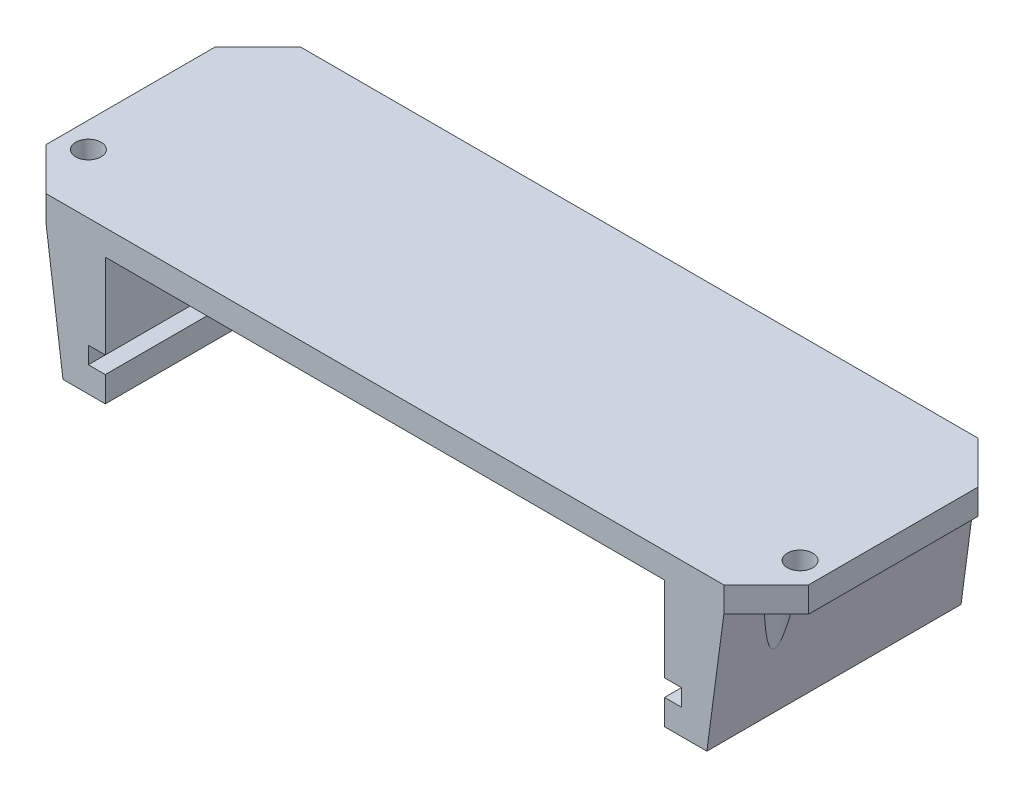
ISO-10303-21;
HEADER;
FILE_DESCRIPTION(('STEP AP214'),'2;1');
FILE_NAME('part.step','',(''),(''),'','','');
FILE_SCHEMA(('AUTOMOTIVE_DESIGN { 1 0 10303 214 1 1 1 1 }'));
ENDSEC;
DATA;
#1=APPLICATION_CONTEXT('core data for automotive mechanical design processes');
#2=APPLICATION_PROTOCOL_DEFINITION('international standard','automotive_design',2000,#1);
#3=PRODUCT_CONTEXT('',#1,'mechanical');
#4=PRODUCT('Part','Part','',(#3));
#5=PRODUCT_RELATED_PRODUCT_CATEGORY('part','',(#4));
#6=PRODUCT_DEFINITION_FORMATION('','',#4);
#7=PRODUCT_DEFINITION_CONTEXT('part definition',#1,'design');
#8=PRODUCT_DEFINITION('design','',#6,#7);
#9=PRODUCT_DEFINITION_SHAPE('','',#8);
#10=(LENGTH_UNIT() NAMED_UNIT(*) SI_UNIT(.MILLI.,.METRE.));
#11=(NAMED_UNIT(*) PLANE_ANGLE_UNIT() SI_UNIT($,.RADIAN.));
#12=(NAMED_UNIT(*) SI_UNIT($,.STERADIAN.) SOLID_ANGLE_UNIT());
#13=UNCERTAINTY_MEASURE_WITH_UNIT(LENGTH_MEASURE(1.E-05),#10,'distance_accuracy_value','');
#14=(GEOMETRIC_REPRESENTATION_CONTEXT(3) GLOBAL_UNCERTAINTY_ASSIGNED_CONTEXT((#13)) GLOBAL_UNIT_ASSIGNED_CONTEXT((#10,
#11,#12)) REPRESENTATION_CONTEXT('',''));
#15=CARTESIAN_POINT('',(0.,0.,0.));
#16=DIRECTION('',(0.,0.,1.));
#17=DIRECTION('',(1.,0.,0.));
#18=AXIS2_PLACEMENT_3D('',#15,#16,#17);
#19=CARTESIAN_POINT('',(-4.50560941751226,-0.600747922334966,-30.));
#20=DIRECTION('',(0.991227900682635,0.132163720091018,0.));
#21=DIRECTION('',(-0.132163720091018,0.991227900682635,0.));
#22=AXIS2_PLACEMENT_3D('',#19,#20,#21);
#23=PLANE('',#22);
#24=CARTESIAN_POINT('',(-7.,18.1071814463232,-7.));
#25=DIRECTION('',(0.991227900682635,0.132163720091018,0.));
#26=DIRECTION('',(-0.132163720091018,0.991227900682635,0.));
#27=AXIS2_PLACEMENT_3D('',#24,#25,#26);
#28=ELLIPSE('',#27,22.6991189256324,3.);
#29=CARTESIAN_POINT('',(-5.,3.10718144632311,-9.23606797749979));
#30=VERTEX_POINT('',#29);
#31=CARTESIAN_POINT('',(-5.,3.10718144632312,-4.76393202250021));
#32=VERTEX_POINT('',#31);
#33=EDGE_CURVE('E196',#30,#32,#28,.F.);
#34=ORIENTED_EDGE('',*,*,#33,.F.);
#35=DIRECTION('',(0.,0.,1.));
#36=VECTOR('',#35,1.);
#37=CARTESIAN_POINT('',(-5.,3.10718144632312,-30.));
#38=LINE('',#37,#36);
#39=CARTESIAN_POINT('',(-5.,3.10718144632312,-30.));
#40=VERTEX_POINT('',#39);
#41=EDGE_CURVE('E210',#40,#30,#38,.T.);
#42=ORIENTED_EDGE('',*,*,#41,.F.);
#43=DIRECTION('',(-0.132163720091018,0.991227900682635,0.));
#44=VECTOR('',#43,1.);
#45=CARTESIAN_POINT('',(-4.50560941751226,-0.600747922334966,-30.));
#46=LINE('',#45,#44);
#47=CARTESIAN_POINT('',(-3.,-11.8928185536769,-30.));
#48=VERTEX_POINT('',#47);
#49=EDGE_CURVE('E312',#48,#40,#46,.T.);
#50=ORIENTED_EDGE('',*,*,#49,.F.);
#51=DIRECTION('',(0.,0.,1.));
#52=VECTOR('',#51,1.);
#53=CARTESIAN_POINT('',(-3.,-11.8928185536769,-30.));
#54=LINE('',#53,#52);
#55=CARTESIAN_POINT('',(-3.,-11.8928185536769,0.));
#56=VERTEX_POINT('',#55);
#57=EDGE_CURVE('E267',#48,#56,#54,.T.);
#58=ORIENTED_EDGE('',*,*,#57,.T.);
#59=DIRECTION('',(-0.132163720091018,0.991227900682635,0.));
#60=VECTOR('',#59,1.);
#61=CARTESIAN_POINT('',(-4.50560941751226,-0.600747922334966,0.));
#62=LINE('',#61,#60);
#63=CARTESIAN_POINT('',(-5.,3.10718144632312,0.));
#64=VERTEX_POINT('',#63);
#65=EDGE_CURVE('E214',#56,#64,#62,.T.);
#66=ORIENTED_EDGE('',*,*,#65,.T.);
#67=EDGE_CURVE('E208',#32,#64,#38,.T.);
#68=ORIENTED_EDGE('',*,*,#67,.F.);
#69=EDGE_LOOP('',(#34,#42,#50,#58,#66,#68));
#70=FACE_BOUND('',#69,.T.);
#71=ADVANCED_FACE('F36',(#70),#23,.F.);
#72=CARTESIAN_POINT('',(0.,3.10718144632312,-30.));
#73=DIRECTION('',(0.,-1.,0.));
#74=DIRECTION('',(0.,0.,-1.));
#75=AXIS2_PLACEMENT_3D('',#72,#73,#74);
#76=PLANE('',#75);
#77=ORIENTED_EDGE('',*,*,#67,.T.);
#78=DIRECTION('',(-0.707106781186549,0.,-0.707106781186547));
#79=VECTOR('',#78,1.);
#80=CARTESIAN_POINT('',(-17.5,3.10718144632312,-12.5));
#81=LINE('',#80,#79);
#82=CARTESIAN_POINT('',(-10.,3.10718144632312,-4.99999999999999));
#83=VERTEX_POINT('',#82);
#84=EDGE_CURVE('E11',#64,#83,#81,.T.);
#85=ORIENTED_EDGE('',*,*,#84,.T.);
#86=DIRECTION('',(0.,0.,1.));
#87=VECTOR('',#86,1.);
#88=CARTESIAN_POINT('',(-10.,3.10718144632312,-30.));
#89=LINE('',#88,#87);
#90=CARTESIAN_POINT('',(-10.,3.10718144632312,-25.));
#91=VERTEX_POINT('',#90);
#92=EDGE_CURVE('E215',#91,#83,#89,.T.);
#93=ORIENTED_EDGE('',*,*,#92,.F.);
#94=DIRECTION('',(-0.707106781186547,0.,0.707106781186549));
#95=VECTOR('',#94,1.);
#96=CARTESIAN_POINT('',(-2.5,3.10718144632312,-32.5));
#97=LINE('',#96,#95);
#98=EDGE_CURVE('E44',#91,#40,#97,.F.);
#99=ORIENTED_EDGE('',*,*,#98,.T.);
#100=ORIENTED_EDGE('',*,*,#41,.T.);
#101=CARTESIAN_POINT('',(-7.,3.10718144632312,-7.));
#102=DIRECTION('',(0.,-1.,0.));
#103=DIRECTION('',(0.,0.,-1.));
#104=AXIS2_PLACEMENT_3D('',#101,#102,#103);
#105=CIRCLE('',#104,3.);
#106=EDGE_CURVE('E199',#30,#32,#105,.T.);
#107=ORIENTED_EDGE('',*,*,#106,.T.);
#108=EDGE_LOOP('',(#77,#85,#93,#99,#100,#107));
#109=FACE_BOUND('',#108,.T.);
#110=CARTESIAN_POINT('',(-7.,3.10718144632312,-7.));
#111=DIRECTION('',(0.,-1.,0.));
#112=DIRECTION('',(0.,0.,-1.));
#113=AXIS2_PLACEMENT_3D('',#110,#111,#112);
#114=CIRCLE('',#113,1.5);
#115=CARTESIAN_POINT('',(-7.,3.10718144632312,-8.5));
#116=VERTEX_POINT('',#115);
#117=EDGE_CURVE('E273',#116,#116,#114,.T.);
#118=ORIENTED_EDGE('',*,*,#117,.F.);
#119=EDGE_LOOP('',(#118));
#120=FACE_BOUND('',#119,.T.);
#121=ADVANCED_FACE('F206',(#109,#120),#76,.T.);
#122=CARTESIAN_POINT('',(-10.,0.,-30.));
#123=DIRECTION('',(1.,0.,0.));
#124=DIRECTION('',(0.,1.,0.));
#125=AXIS2_PLACEMENT_3D('',#122,#123,#124);
#126=PLANE('',#125);
#127=ORIENTED_EDGE('',*,*,#92,.T.);
#128=DIRECTION('',(0.,1.,0.));
#129=VECTOR('',#128,1.);
#130=CARTESIAN_POINT('',(-10.,6.10718144632312,-4.99999999999999));
#131=LINE('',#130,#129);
#132=CARTESIAN_POINT('',(-10.,6.10718144632312,-4.99999999999999));
#133=VERTEX_POINT('',#132);
#134=EDGE_CURVE('E304',#83,#133,#131,.T.);
#135=ORIENTED_EDGE('',*,*,#134,.T.);
#136=DIRECTION('',(0.,0.,1.));
#137=VECTOR('',#136,1.);
#138=CARTESIAN_POINT('',(-10.,6.10718144632312,-30.));
#139=LINE('',#138,#137);
#140=CARTESIAN_POINT('',(-10.,6.10718144632312,-25.));
#141=VERTEX_POINT('',#140);
#142=EDGE_CURVE('E218',#141,#133,#139,.T.);
#143=ORIENTED_EDGE('',*,*,#142,.F.);
#144=DIRECTION('',(0.,-1.,0.));
#145=VECTOR('',#144,1.);
#146=CARTESIAN_POINT('',(-10.,0.,-25.));
#147=LINE('',#146,#145);
#148=EDGE_CURVE('E56',#141,#91,#147,.T.);
#149=ORIENTED_EDGE('',*,*,#148,.T.);
#150=EDGE_LOOP('',(#127,#135,#143,#149));
#151=FACE_BOUND('',#150,.T.);
#152=ADVANCED_FACE('F323',(#151),#126,.F.);
#153=CARTESIAN_POINT('',(0.,6.10718144632312,-30.));
#154=DIRECTION('',(0.,-1.,0.));
#155=DIRECTION('',(0.,0.,-1.));
#156=AXIS2_PLACEMENT_3D('',#153,#154,#155);
#157=PLANE('',#156);
#158=CARTESIAN_POINT('',(77.,6.10718144632312,-7.));
#159=DIRECTION('',(0.,-1.,0.));
#160=DIRECTION('',(0.,0.,-1.));
#161=AXIS2_PLACEMENT_3D('',#158,#159,#160);
#162=CIRCLE('',#161,1.5);
#163=CARTESIAN_POINT('',(77.,6.10718144632312,-8.5));
#164=VERTEX_POINT('',#163);
#165=EDGE_CURVE('E408',#164,#164,#162,.T.);
#166=ORIENTED_EDGE('',*,*,#165,.T.);
#167=EDGE_LOOP('',(#166));
#168=FACE_BOUND('',#167,.T.);
#169=CARTESIAN_POINT('',(-7.,6.10718144632312,-7.));
#170=DIRECTION('',(0.,-1.,0.));
#171=DIRECTION('',(0.,0.,-1.));
#172=AXIS2_PLACEMENT_3D('',#169,#170,#171);
#173=CIRCLE('',#172,1.5);
#174=CARTESIAN_POINT('',(-7.,6.10718144632312,-8.5));
#175=VERTEX_POINT('',#174);
#176=EDGE_CURVE('E270',#175,#175,#173,.T.);
#177=ORIENTED_EDGE('',*,*,#176,.T.);
#178=EDGE_LOOP('',(#177));
#179=FACE_BOUND('',#178,.T.);
#180=DIRECTION('',(1.,0.,0.));
#181=VECTOR('',#180,1.);
#182=CARTESIAN_POINT('',(0.,6.10718144632312,0.));
#183=LINE('',#182,#181);
#184=CARTESIAN_POINT('',(-4.99999999999999,6.10718144632312,0.));
#185=VERTEX_POINT('',#184);
#186=CARTESIAN_POINT('',(75.,6.10718144632312,0.));
#187=VERTEX_POINT('',#186);
#188=EDGE_CURVE('E221',#185,#187,#183,.T.);
#189=ORIENTED_EDGE('',*,*,#188,.T.);
#190=DIRECTION('',(-0.707106781186547,0.,0.707106781186549));
#191=VECTOR('',#190,1.);
#192=CARTESIAN_POINT('',(75.,6.10718144632312,0.));
#193=LINE('',#192,#191);
#194=CARTESIAN_POINT('',(80.,6.10718144632312,-5.));
#195=VERTEX_POINT('',#194);
#196=EDGE_CURVE('E287',#187,#195,#193,.F.);
#197=ORIENTED_EDGE('',*,*,#196,.T.);
#198=DIRECTION('',(0.,0.,1.));
#199=VECTOR('',#198,1.);
#200=CARTESIAN_POINT('',(80.,6.10718144632312,-30.));
#201=LINE('',#200,#199);
#202=CARTESIAN_POINT('',(80.,6.10718144632312,-25.));
#203=VERTEX_POINT('',#202);
#204=EDGE_CURVE('E226',#203,#195,#201,.T.);
#205=ORIENTED_EDGE('',*,*,#204,.F.);
#206=DIRECTION('',(-0.707106781186549,0.,-0.707106781186547));
#207=VECTOR('',#206,1.);
#208=CARTESIAN_POINT('',(80.,6.10718144632312,-25.));
#209=LINE('',#208,#207);
#210=CARTESIAN_POINT('',(75.,6.10718144632312,-30.));
#211=VERTEX_POINT('',#210);
#212=EDGE_CURVE('E285',#203,#211,#209,.T.);
#213=ORIENTED_EDGE('',*,*,#212,.T.);
#214=DIRECTION('',(1.,0.,0.));
#215=VECTOR('',#214,1.);
#216=CARTESIAN_POINT('',(0.,6.10718144632312,-30.));
#217=LINE('',#216,#215);
#218=CARTESIAN_POINT('',(-4.99999999999998,6.10718144632312,-30.));
#219=VERTEX_POINT('',#218);
#220=EDGE_CURVE('E269',#219,#211,#217,.T.);
#221=ORIENTED_EDGE('',*,*,#220,.F.);
#222=DIRECTION('',(0.707106781186547,0.,-0.707106781186549));
#223=VECTOR('',#222,1.);
#224=CARTESIAN_POINT('',(-4.99999999999998,6.10718144632312,-30.));
#225=LINE('',#224,#223);
#226=EDGE_CURVE('E281',#219,#141,#225,.F.);
#227=ORIENTED_EDGE('',*,*,#226,.T.);
#228=ORIENTED_EDGE('',*,*,#142,.T.);
#229=DIRECTION('',(0.707106781186549,0.,0.707106781186547));
#230=VECTOR('',#229,1.);
#231=CARTESIAN_POINT('',(-10.,6.10718144632312,-4.99999999999999));
#232=LINE('',#231,#230);
#233=EDGE_CURVE('E283',#133,#185,#232,.T.);
#234=ORIENTED_EDGE('',*,*,#233,.T.);
#235=EDGE_LOOP('',(#189,#197,#205,#213,#221,#227,#228,#234));
#236=FACE_BOUND('',#235,.T.);
#237=ADVANCED_FACE('F322',(#168,#179,#236),#157,.F.);
#238=CARTESIAN_POINT('',(80.,0.,-30.));
#239=DIRECTION('',(1.,0.,0.));
#240=DIRECTION('',(0.,0.,-1.));
#241=AXIS2_PLACEMENT_3D('',#238,#239,#240);
#242=PLANE('',#241);
#243=ORIENTED_EDGE('',*,*,#204,.T.);
#244=DIRECTION('',(0.,-1.,0.));
#245=VECTOR('',#244,1.);
#246=CARTESIAN_POINT('',(80.,0.,-5.));
#247=LINE('',#246,#245);
#248=CARTESIAN_POINT('',(80.,3.10718144632312,-5.));
#249=VERTEX_POINT('',#248);
#250=EDGE_CURVE('E292',#195,#249,#247,.T.);
#251=ORIENTED_EDGE('',*,*,#250,.T.);
#252=DIRECTION('',(0.,0.,1.));
#253=VECTOR('',#252,1.);
#254=CARTESIAN_POINT('',(80.,3.10718144632312,-30.));
#255=LINE('',#254,#253);
#256=CARTESIAN_POINT('',(80.,3.10718144632312,-25.));
#257=VERTEX_POINT('',#256);
#258=EDGE_CURVE('E229',#257,#249,#255,.T.);
#259=ORIENTED_EDGE('',*,*,#258,.F.);
#260=DIRECTION('',(0.,1.,0.));
#261=VECTOR('',#260,1.);
#262=CARTESIAN_POINT('',(80.,6.10718144632312,-25.));
#263=LINE('',#262,#261);
#264=EDGE_CURVE('E289',#257,#203,#263,.T.);
#265=ORIENTED_EDGE('',*,*,#264,.T.);
#266=EDGE_LOOP('',(#243,#251,#259,#265));
#267=FACE_BOUND('',#266,.T.);
#268=ADVANCED_FACE('F434',(#267),#242,.T.);
#269=ORIENTED_EDGE('',*,*,#258,.T.);
#270=DIRECTION('',(0.707106781186547,0.,-0.707106781186549));
#271=VECTOR('',#270,1.);
#272=CARTESIAN_POINT('',(52.5000000000001,3.10718144632312,22.5));
#273=LINE('',#272,#271);
#274=CARTESIAN_POINT('',(74.9999999999999,3.10718144632312,0.));
#275=VERTEX_POINT('',#274);
#276=EDGE_CURVE('E296',#249,#275,#273,.F.);
#277=ORIENTED_EDGE('',*,*,#276,.T.);
#278=DIRECTION('',(0.,0.,1.));
#279=VECTOR('',#278,1.);
#280=CARTESIAN_POINT('',(74.9999999999999,3.10718144632312,-30.));
#281=LINE('',#280,#279);
#282=CARTESIAN_POINT('',(74.9999999999999,3.10718144632312,-4.76393202250026));
#283=VERTEX_POINT('',#282);
#284=EDGE_CURVE('E235',#283,#275,#281,.T.);
#285=ORIENTED_EDGE('',*,*,#284,.F.);
#286=CARTESIAN_POINT('',(77.,3.10718144632312,-7.));
#287=DIRECTION('',(0.,-1.,0.));
#288=DIRECTION('',(0.,0.,-1.));
#289=AXIS2_PLACEMENT_3D('',#286,#287,#288);
#290=CIRCLE('',#289,3.00000000000001);
#291=CARTESIAN_POINT('',(74.9999999999999,3.10718144632312,-9.23606797749973));
#292=VERTEX_POINT('',#291);
#293=EDGE_CURVE('E204',#283,#292,#290,.T.);
#294=ORIENTED_EDGE('',*,*,#293,.T.);
#295=CARTESIAN_POINT('',(74.9999999999999,3.10718144632312,-30.));
#296=VERTEX_POINT('',#295);
#297=EDGE_CURVE('E232',#296,#292,#281,.T.);
#298=ORIENTED_EDGE('',*,*,#297,.F.);
#299=DIRECTION('',(0.707106781186549,0.,0.707106781186547));
#300=VECTOR('',#299,1.);
#301=CARTESIAN_POINT('',(37.4999999999999,3.10718144632312,-67.5));
#302=LINE('',#301,#300);
#303=EDGE_CURVE('E294',#296,#257,#302,.T.);
#304=ORIENTED_EDGE('',*,*,#303,.T.);
#305=EDGE_LOOP('',(#269,#277,#285,#294,#298,#304));
#306=FACE_BOUND('',#305,.T.);
#307=CARTESIAN_POINT('',(77.,3.10718144632312,-7.));
#308=DIRECTION('',(0.,-1.,0.));
#309=DIRECTION('',(0.,0.,-1.));
#310=AXIS2_PLACEMENT_3D('',#307,#308,#309);
#311=CIRCLE('',#310,1.5);
#312=CARTESIAN_POINT('',(77.,3.10718144632312,-8.5));
#313=VERTEX_POINT('',#312);
#314=EDGE_CURVE('E411',#313,#313,#311,.T.);
#315=ORIENTED_EDGE('',*,*,#314,.F.);
#316=EDGE_LOOP('',(#315));
#317=FACE_BOUND('',#316,.T.);
#318=ADVANCED_FACE('F418',(#306,#317),#76,.T.);
#319=CARTESIAN_POINT('',(73.2829019939315,-9.77105359919046,-30.));
#320=DIRECTION('',(0.991227900682635,-0.132163720091013,0.));
#321=DIRECTION('',(0.132163720091013,0.991227900682636,0.));
#322=AXIS2_PLACEMENT_3D('',#319,#320,#321);
#323=PLANE('',#322);
#324=ORIENTED_EDGE('',*,*,#297,.T.);
#325=CARTESIAN_POINT('',(77.,18.1071814463243,-7.));
#326=DIRECTION('',(0.991227900682635,-0.132163720091013,0.));
#327=DIRECTION('',(0.132163720091013,0.991227900682635,0.));
#328=AXIS2_PLACEMENT_3D('',#325,#326,#327);
#329=ELLIPSE('',#328,22.6991189256333,3.00000000000001);
#330=EDGE_CURVE('E217',#292,#283,#329,.F.);
#331=ORIENTED_EDGE('',*,*,#330,.T.);
#332=ORIENTED_EDGE('',*,*,#284,.T.);
#333=DIRECTION('',(0.132163720091013,0.991227900682636,0.));
#334=VECTOR('',#333,1.);
#335=CARTESIAN_POINT('',(73.2829019939315,-9.77105359919046,0.));
#336=LINE('',#335,#334);
#337=CARTESIAN_POINT('',(73.,-11.8928185536769,0.));
#338=VERTEX_POINT('',#337);
#339=EDGE_CURVE('E333',#338,#275,#336,.T.);
#340=ORIENTED_EDGE('',*,*,#339,.F.);
#341=DIRECTION('',(0.,0.,1.));
#342=VECTOR('',#341,1.);
#343=CARTESIAN_POINT('',(73.,-11.8928185536769,-30.));
#344=LINE('',#343,#342);
#345=CARTESIAN_POINT('',(73.,-11.8928185536769,-30.));
#346=VERTEX_POINT('',#345);
#347=EDGE_CURVE('E236',#346,#338,#344,.T.);
#348=ORIENTED_EDGE('',*,*,#347,.F.);
#349=DIRECTION('',(0.132163720091013,0.991227900682636,0.));
#350=VECTOR('',#349,1.);
#351=CARTESIAN_POINT('',(73.2829019939315,-9.77105359919046,-30.));
#352=LINE('',#351,#350);
#353=EDGE_CURVE('E371',#346,#296,#352,.T.);
#354=ORIENTED_EDGE('',*,*,#353,.T.);
#355=EDGE_LOOP('',(#324,#331,#332,#340,#348,#354));
#356=FACE_BOUND('',#355,.T.);
#357=ADVANCED_FACE('F423',(#356),#323,.T.);
#358=CARTESIAN_POINT('',(0.,-11.8928185536769,-30.));
#359=DIRECTION('',(0.,-1.,0.));
#360=DIRECTION('',(0.,0.,-1.));
#361=AXIS2_PLACEMENT_3D('',#358,#359,#360);
#362=PLANE('',#361);
#363=DIRECTION('',(1.,0.,0.));
#364=VECTOR('',#363,1.);
#365=CARTESIAN_POINT('',(0.,-11.8928185536769,0.));
#366=LINE('',#365,#364);
#367=CARTESIAN_POINT('',(68.,-11.8928185536769,0.));
#368=VERTEX_POINT('',#367);
#369=EDGE_CURVE('E334',#368,#338,#366,.T.);
#370=ORIENTED_EDGE('',*,*,#369,.F.);
#371=DIRECTION('',(0.,0.,1.));
#372=VECTOR('',#371,1.);
#373=CARTESIAN_POINT('',(68.,-11.8928185536769,-30.));
#374=LINE('',#373,#372);
#375=CARTESIAN_POINT('',(68.,-11.8928185536769,-30.));
#376=VERTEX_POINT('',#375);
#377=EDGE_CURVE('E238',#376,#368,#374,.T.);
#378=ORIENTED_EDGE('',*,*,#377,.F.);
#379=DIRECTION('',(1.,0.,0.));
#380=VECTOR('',#379,1.);
#381=CARTESIAN_POINT('',(0.,-11.8928185536769,-30.));
#382=LINE('',#381,#380);
#383=EDGE_CURVE('E374',#376,#346,#382,.T.);
#384=ORIENTED_EDGE('',*,*,#383,.T.);
#385=ORIENTED_EDGE('',*,*,#347,.T.);
#386=EDGE_LOOP('',(#370,#378,#384,#385));
#387=FACE_BOUND('',#386,.T.);
#388=ADVANCED_FACE('F442',(#387),#362,.T.);
#389=CARTESIAN_POINT('',(68.,0.,-30.));
#390=DIRECTION('',(-1.,0.,0.));
#391=DIRECTION('',(0.,0.,1.));
#392=AXIS2_PLACEMENT_3D('',#389,#390,#391);
#393=PLANE('',#392);
#394=DIRECTION('',(0.,-1.,0.));
#395=VECTOR('',#394,1.);
#396=CARTESIAN_POINT('',(68.,0.,0.));
#397=LINE('',#396,#395);
#398=CARTESIAN_POINT('',(68.,-8.89281855367688,0.));
#399=VERTEX_POINT('',#398);
#400=EDGE_CURVE('E337',#399,#368,#397,.T.);
#401=ORIENTED_EDGE('',*,*,#400,.F.);
#402=DIRECTION('',(0.,0.,1.));
#403=VECTOR('',#402,1.);
#404=CARTESIAN_POINT('',(68.,-8.89281855367688,-30.));
#405=LINE('',#404,#403);
#406=CARTESIAN_POINT('',(68.,-8.89281855367688,-30.));
#407=VERTEX_POINT('',#406);
#408=EDGE_CURVE('E240',#407,#399,#405,.T.);
#409=ORIENTED_EDGE('',*,*,#408,.F.);
#410=DIRECTION('',(0.,-1.,0.));
#411=VECTOR('',#410,1.);
#412=CARTESIAN_POINT('',(68.,0.,-30.));
#413=LINE('',#412,#411);
#414=EDGE_CURVE('E377',#407,#376,#413,.T.);
#415=ORIENTED_EDGE('',*,*,#414,.T.);
#416=ORIENTED_EDGE('',*,*,#377,.T.);
#417=EDGE_LOOP('',(#401,#409,#415,#416));
#418=FACE_BOUND('',#417,.T.);
#419=ADVANCED_FACE('F446',(#418),#393,.T.);
#420=CARTESIAN_POINT('',(0.,-8.89281855367682,-30.));
#421=DIRECTION('',(0.,1.,0.));
#422=DIRECTION('',(-1.,0.,0.));
#423=AXIS2_PLACEMENT_3D('',#420,#421,#422);
#424=PLANE('',#423);
#425=DIRECTION('',(-1.,0.,0.));
#426=VECTOR('',#425,1.);
#427=CARTESIAN_POINT('',(0.,-8.89281855367682,0.));
#428=LINE('',#427,#426);
#429=CARTESIAN_POINT('',(70.,-8.89281855367688,0.));
#430=VERTEX_POINT('',#429);
#431=EDGE_CURVE('E342',#430,#399,#428,.T.);
#432=ORIENTED_EDGE('',*,*,#431,.F.);
#433=DIRECTION('',(0.,0.,1.));
#434=VECTOR('',#433,1.);
#435=CARTESIAN_POINT('',(70.,-8.89281855367688,-30.));
#436=LINE('',#435,#434);
#437=CARTESIAN_POINT('',(70.,-8.89281855367688,-30.));
#438=VERTEX_POINT('',#437);
#439=EDGE_CURVE('E242',#438,#430,#436,.T.);
#440=ORIENTED_EDGE('',*,*,#439,.F.);
#441=DIRECTION('',(-1.,0.,0.));
#442=VECTOR('',#441,1.);
#443=CARTESIAN_POINT('',(0.,-8.89281855367682,-30.));
#444=LINE('',#443,#442);
#445=EDGE_CURVE('E380',#438,#407,#444,.T.);
#446=ORIENTED_EDGE('',*,*,#445,.T.);
#447=ORIENTED_EDGE('',*,*,#408,.T.);
#448=EDGE_LOOP('',(#432,#440,#446,#447));
#449=FACE_BOUND('',#448,.T.);
#450=ADVANCED_FACE('F449',(#449),#424,.T.);
#451=CARTESIAN_POINT('',(70.,0.,-30.));
#452=DIRECTION('',(-1.,0.,0.));
#453=DIRECTION('',(0.,0.,1.));
#454=AXIS2_PLACEMENT_3D('',#451,#452,#453);
#455=PLANE('',#454);
#456=DIRECTION('',(0.,-1.,0.));
#457=VECTOR('',#456,1.);
#458=CARTESIAN_POINT('',(70.,0.,0.));
#459=LINE('',#458,#457);
#460=CARTESIAN_POINT('',(70.,-6.89281855367689,0.));
#461=VERTEX_POINT('',#460);
#462=EDGE_CURVE('E345',#461,#430,#459,.T.);
#463=ORIENTED_EDGE('',*,*,#462,.F.);
#464=DIRECTION('',(0.,0.,1.));
#465=VECTOR('',#464,1.);
#466=CARTESIAN_POINT('',(70.,-6.89281855367689,-30.));
#467=LINE('',#466,#465);
#468=CARTESIAN_POINT('',(70.,-6.89281855367689,-30.));
#469=VERTEX_POINT('',#468);
#470=EDGE_CURVE('E244',#469,#461,#467,.T.);
#471=ORIENTED_EDGE('',*,*,#470,.F.);
#472=DIRECTION('',(0.,-1.,0.));
#473=VECTOR('',#472,1.);
#474=CARTESIAN_POINT('',(70.,0.,-30.));
#475=LINE('',#474,#473);
#476=EDGE_CURVE('E383',#469,#438,#475,.T.);
#477=ORIENTED_EDGE('',*,*,#476,.T.);
#478=ORIENTED_EDGE('',*,*,#439,.T.);
#479=EDGE_LOOP('',(#463,#471,#477,#478));
#480=FACE_BOUND('',#479,.T.);
#481=ADVANCED_FACE('F454',(#480),#455,.T.);
#482=CARTESIAN_POINT('',(0.,-6.89281855367689,-30.));
#483=DIRECTION('',(0.,-1.,0.));
#484=DIRECTION('',(0.,0.,-1.));
#485=AXIS2_PLACEMENT_3D('',#482,#483,#484);
#486=PLANE('',#485);
#487=DIRECTION('',(1.,0.,0.));
#488=VECTOR('',#487,1.);
#489=CARTESIAN_POINT('',(0.,-6.89281855367689,0.));
#490=LINE('',#489,#488);
#491=CARTESIAN_POINT('',(68.,-6.89281855367689,0.));
#492=VERTEX_POINT('',#491);
#493=EDGE_CURVE('E348',#492,#461,#490,.T.);
#494=ORIENTED_EDGE('',*,*,#493,.F.);
#495=DIRECTION('',(0.,0.,1.));
#496=VECTOR('',#495,1.);
#497=CARTESIAN_POINT('',(68.,-6.89281855367689,-30.));
#498=LINE('',#497,#496);
#499=CARTESIAN_POINT('',(68.,-6.89281855367689,-30.));
#500=VERTEX_POINT('',#499);
#501=EDGE_CURVE('E246',#500,#492,#498,.T.);
#502=ORIENTED_EDGE('',*,*,#501,.F.);
#503=DIRECTION('',(1.,0.,0.));
#504=VECTOR('',#503,1.);
#505=CARTESIAN_POINT('',(0.,-6.89281855367689,-30.));
#506=LINE('',#505,#504);
#507=EDGE_CURVE('E386',#500,#469,#506,.T.);
#508=ORIENTED_EDGE('',*,*,#507,.T.);
#509=ORIENTED_EDGE('',*,*,#470,.T.);
#510=EDGE_LOOP('',(#494,#502,#508,#509));
#511=FACE_BOUND('',#510,.T.);
#512=ADVANCED_FACE('F457',(#511),#486,.T.);
#513=CARTESIAN_POINT('',(68.,0.,-30.));
#514=DIRECTION('',(-1.,0.,0.));
#515=DIRECTION('',(0.,0.,1.));
#516=AXIS2_PLACEMENT_3D('',#513,#514,#515);
#517=PLANE('',#516);
#518=DIRECTION('',(0.,-1.,0.));
#519=VECTOR('',#518,1.);
#520=CARTESIAN_POINT('',(68.,0.,0.));
#521=LINE('',#520,#519);
#522=CARTESIAN_POINT('',(68.,3.10718144632312,0.));
#523=VERTEX_POINT('',#522);
#524=EDGE_CURVE('E351',#523,#492,#521,.T.);
#525=ORIENTED_EDGE('',*,*,#524,.F.);
#526=DIRECTION('',(0.,0.,1.));
#527=VECTOR('',#526,1.);
#528=CARTESIAN_POINT('',(68.,3.10718144632312,-30.));
#529=LINE('',#528,#527);
#530=CARTESIAN_POINT('',(68.,3.10718144632312,-30.));
#531=VERTEX_POINT('',#530);
#532=EDGE_CURVE('E248',#531,#523,#529,.T.);
#533=ORIENTED_EDGE('',*,*,#532,.F.);
#534=DIRECTION('',(0.,-1.,0.));
#535=VECTOR('',#534,1.);
#536=CARTESIAN_POINT('',(68.,0.,-30.));
#537=LINE('',#536,#535);
#538=EDGE_CURVE('E389',#531,#500,#537,.T.);
#539=ORIENTED_EDGE('',*,*,#538,.T.);
#540=ORIENTED_EDGE('',*,*,#501,.T.);
#541=EDGE_LOOP('',(#525,#533,#539,#540));
#542=FACE_BOUND('',#541,.T.);
#543=ADVANCED_FACE('F462',(#542),#517,.T.);
#544=DIRECTION('',(1.,0.,0.));
#545=VECTOR('',#544,1.);
#546=CARTESIAN_POINT('',(0.,3.10718144632312,0.));
#547=LINE('',#546,#545);
#548=CARTESIAN_POINT('',(2.,3.10718144632312,0.));
#549=VERTEX_POINT('',#548);
#550=EDGE_CURVE('E354',#549,#523,#547,.T.);
#551=ORIENTED_EDGE('',*,*,#550,.F.);
#552=DIRECTION('',(0.,0.,1.));
#553=VECTOR('',#552,1.);
#554=CARTESIAN_POINT('',(2.,3.10718144632312,-30.));
#555=LINE('',#554,#553);
#556=CARTESIAN_POINT('',(2.,3.10718144632312,-30.));
#557=VERTEX_POINT('',#556);
#558=EDGE_CURVE('E250',#557,#549,#555,.T.);
#559=ORIENTED_EDGE('',*,*,#558,.F.);
#560=DIRECTION('',(1.,0.,0.));
#561=VECTOR('',#560,1.);
#562=CARTESIAN_POINT('',(0.,3.10718144632312,-30.));
#563=LINE('',#562,#561);
#564=EDGE_CURVE('E392',#557,#531,#563,.T.);
#565=ORIENTED_EDGE('',*,*,#564,.T.);
#566=ORIENTED_EDGE('',*,*,#532,.T.);
#567=EDGE_LOOP('',(#551,#559,#565,#566));
#568=FACE_BOUND('',#567,.T.);
#569=ADVANCED_FACE('F465',(#568),#76,.T.);
#570=CARTESIAN_POINT('',(2.,0.,-30.));
#571=DIRECTION('',(-1.,0.,0.));
#572=DIRECTION('',(0.,0.,1.));
#573=AXIS2_PLACEMENT_3D('',#570,#571,#572);
#574=PLANE('',#573);
#575=DIRECTION('',(0.,-1.,0.));
#576=VECTOR('',#575,1.);
#577=CARTESIAN_POINT('',(2.,0.,0.));
#578=LINE('',#577,#576);
#579=CARTESIAN_POINT('',(2.,-6.89281855367688,0.));
#580=VERTEX_POINT('',#579);
#581=EDGE_CURVE('E357',#549,#580,#578,.T.);
#582=ORIENTED_EDGE('',*,*,#581,.T.);
#583=DIRECTION('',(0.,0.,1.));
#584=VECTOR('',#583,1.);
#585=CARTESIAN_POINT('',(2.,-6.89281855367688,-30.));
#586=LINE('',#585,#584);
#587=CARTESIAN_POINT('',(2.,-6.89281855367688,-30.));
#588=VERTEX_POINT('',#587);
#589=EDGE_CURVE('E252',#588,#580,#586,.T.);
#590=ORIENTED_EDGE('',*,*,#589,.F.);
#591=DIRECTION('',(0.,-1.,0.));
#592=VECTOR('',#591,1.);
#593=CARTESIAN_POINT('',(2.,0.,-30.));
#594=LINE('',#593,#592);
#595=EDGE_CURVE('E395',#557,#588,#594,.T.);
#596=ORIENTED_EDGE('',*,*,#595,.F.);
#597=ORIENTED_EDGE('',*,*,#558,.T.);
#598=EDGE_LOOP('',(#582,#590,#596,#597));
#599=FACE_BOUND('',#598,.T.);
#600=ADVANCED_FACE('F471',(#599),#574,.F.);
#601=CARTESIAN_POINT('',(0.,-6.89281855367688,-30.));
#602=DIRECTION('',(0.,1.,0.));
#603=DIRECTION('',(0.,0.,1.));
#604=AXIS2_PLACEMENT_3D('',#601,#602,#603);
#605=PLANE('',#604);
#606=DIRECTION('',(-1.,0.,0.));
#607=VECTOR('',#606,1.);
#608=CARTESIAN_POINT('',(0.,-6.89281855367688,0.));
#609=LINE('',#608,#607);
#610=CARTESIAN_POINT('',(0.,-6.89281855367688,0.));
#611=VERTEX_POINT('',#610);
#612=EDGE_CURVE('E359',#580,#611,#609,.T.);
#613=ORIENTED_EDGE('',*,*,#612,.T.);
#614=DIRECTION('',(0.,0.,1.));
#615=VECTOR('',#614,1.);
#616=CARTESIAN_POINT('',(0.,-6.89281855367688,-30.));
#617=LINE('',#616,#615);
#618=CARTESIAN_POINT('',(0.,-6.89281855367688,-30.));
#619=VERTEX_POINT('',#618);
#620=EDGE_CURVE('E255',#619,#611,#617,.T.);
#621=ORIENTED_EDGE('',*,*,#620,.F.);
#622=DIRECTION('',(-1.,0.,0.));
#623=VECTOR('',#622,1.);
#624=CARTESIAN_POINT('',(0.,-6.89281855367688,-30.));
#625=LINE('',#624,#623);
#626=EDGE_CURVE('E397',#588,#619,#625,.T.);
#627=ORIENTED_EDGE('',*,*,#626,.F.);
#628=ORIENTED_EDGE('',*,*,#589,.T.);
#629=EDGE_LOOP('',(#613,#621,#627,#628));
#630=FACE_BOUND('',#629,.T.);
#631=ADVANCED_FACE('F475',(#630),#605,.F.);
#632=CARTESIAN_POINT('',(0.,0.,-30.));
#633=DIRECTION('',(-1.,0.,0.));
#634=DIRECTION('',(0.,0.,1.));
#635=AXIS2_PLACEMENT_3D('',#632,#633,#634);
#636=PLANE('',#635);
#637=DIRECTION('',(0.,-1.,0.));
#638=VECTOR('',#637,1.);
#639=CARTESIAN_POINT('',(0.,0.,0.));
#640=LINE('',#639,#638);
#641=CARTESIAN_POINT('',(0.,-8.89281855367688,0.));
#642=VERTEX_POINT('',#641);
#643=EDGE_CURVE('E361',#611,#642,#640,.T.);
#644=ORIENTED_EDGE('',*,*,#643,.T.);
#645=DIRECTION('',(0.,0.,1.));
#646=VECTOR('',#645,1.);
#647=CARTESIAN_POINT('',(0.,-8.89281855367688,-30.));
#648=LINE('',#647,#646);
#649=CARTESIAN_POINT('',(0.,-8.89281855367688,-30.));
#650=VERTEX_POINT('',#649);
#651=EDGE_CURVE('E258',#650,#642,#648,.T.);
#652=ORIENTED_EDGE('',*,*,#651,.F.);
#653=DIRECTION('',(0.,-1.,0.));
#654=VECTOR('',#653,1.);
#655=CARTESIAN_POINT('',(0.,0.,-30.));
#656=LINE('',#655,#654);
#657=EDGE_CURVE('E399',#619,#650,#656,.T.);
#658=ORIENTED_EDGE('',*,*,#657,.F.);
#659=ORIENTED_EDGE('',*,*,#620,.T.);
#660=EDGE_LOOP('',(#644,#652,#658,#659));
#661=FACE_BOUND('',#660,.T.);
#662=ADVANCED_FACE('F480',(#661),#636,.F.);
#663=CARTESIAN_POINT('',(0.,-8.89281855367688,-30.));
#664=DIRECTION('',(0.,-1.,0.));
#665=DIRECTION('',(0.,0.,-1.));
#666=AXIS2_PLACEMENT_3D('',#663,#664,#665);
#667=PLANE('',#666);
#668=DIRECTION('',(1.,0.,0.));
#669=VECTOR('',#668,1.);
#670=CARTESIAN_POINT('',(0.,-8.89281855367688,0.));
#671=LINE('',#670,#669);
#672=CARTESIAN_POINT('',(2.,-8.89281855367688,0.));
#673=VERTEX_POINT('',#672);
#674=EDGE_CURVE('E363',#642,#673,#671,.T.);
#675=ORIENTED_EDGE('',*,*,#674,.T.);
#676=DIRECTION('',(0.,0.,1.));
#677=VECTOR('',#676,1.);
#678=CARTESIAN_POINT('',(2.,-8.89281855367688,-30.));
#679=LINE('',#678,#677);
#680=CARTESIAN_POINT('',(2.,-8.89281855367688,-30.));
#681=VERTEX_POINT('',#680);
#682=EDGE_CURVE('E261',#681,#673,#679,.T.);
#683=ORIENTED_EDGE('',*,*,#682,.F.);
#684=DIRECTION('',(1.,0.,0.));
#685=VECTOR('',#684,1.);
#686=CARTESIAN_POINT('',(0.,-8.89281855367688,-30.));
#687=LINE('',#686,#685);
#688=EDGE_CURVE('E401',#650,#681,#687,.T.);
#689=ORIENTED_EDGE('',*,*,#688,.F.);
#690=ORIENTED_EDGE('',*,*,#651,.T.);
#691=EDGE_LOOP('',(#675,#683,#689,#690));
#692=FACE_BOUND('',#691,.T.);
#693=ADVANCED_FACE('F486',(#692),#667,.F.);
#694=CARTESIAN_POINT('',(2.,0.,-30.));
#695=DIRECTION('',(-1.,0.,0.));
#696=DIRECTION('',(0.,0.,1.));
#697=AXIS2_PLACEMENT_3D('',#694,#695,#696);
#698=PLANE('',#697);
#699=DIRECTION('',(0.,-1.,0.));
#700=VECTOR('',#699,1.);
#701=CARTESIAN_POINT('',(2.,0.,0.));
#702=LINE('',#701,#700);
#703=CARTESIAN_POINT('',(2.,-11.8928185536769,0.));
#704=VERTEX_POINT('',#703);
#705=EDGE_CURVE('E365',#673,#704,#702,.T.);
#706=ORIENTED_EDGE('',*,*,#705,.T.);
#707=DIRECTION('',(0.,0.,1.));
#708=VECTOR('',#707,1.);
#709=CARTESIAN_POINT('',(2.,-11.8928185536769,-30.));
#710=LINE('',#709,#708);
#711=CARTESIAN_POINT('',(2.,-11.8928185536769,-30.));
#712=VERTEX_POINT('',#711);
#713=EDGE_CURVE('E264',#712,#704,#710,.T.);
#714=ORIENTED_EDGE('',*,*,#713,.F.);
#715=DIRECTION('',(0.,-1.,0.));
#716=VECTOR('',#715,1.);
#717=CARTESIAN_POINT('',(2.,0.,-30.));
#718=LINE('',#717,#716);
#719=EDGE_CURVE('E403',#681,#712,#718,.T.);
#720=ORIENTED_EDGE('',*,*,#719,.F.);
#721=ORIENTED_EDGE('',*,*,#682,.T.);
#722=EDGE_LOOP('',(#706,#714,#720,#721));
#723=FACE_BOUND('',#722,.T.);
#724=ADVANCED_FACE('F490',(#723),#698,.F.);
#725=CARTESIAN_POINT('',(0.,-11.8928185536769,-30.));
#726=DIRECTION('',(0.,1.,0.));
#727=DIRECTION('',(0.,0.,1.));
#728=AXIS2_PLACEMENT_3D('',#725,#726,#727);
#729=PLANE('',#728);
#730=DIRECTION('',(-1.,0.,0.));
#731=VECTOR('',#730,1.);
#732=CARTESIAN_POINT('',(0.,-11.8928185536769,0.));
#733=LINE('',#732,#731);
#734=EDGE_CURVE('E367',#704,#56,#733,.T.);
#735=ORIENTED_EDGE('',*,*,#734,.T.);
#736=ORIENTED_EDGE('',*,*,#57,.F.);
#737=DIRECTION('',(-1.,0.,0.));
#738=VECTOR('',#737,1.);
#739=CARTESIAN_POINT('',(0.,-11.8928185536769,-30.));
#740=LINE('',#739,#738);
#741=EDGE_CURVE('E317',#712,#48,#740,.T.);
#742=ORIENTED_EDGE('',*,*,#741,.F.);
#743=ORIENTED_EDGE('',*,*,#713,.T.);
#744=EDGE_LOOP('',(#735,#736,#742,#743));
#745=FACE_BOUND('',#744,.T.);
#746=ADVANCED_FACE('F493',(#745),#729,.F.);
#747=CARTESIAN_POINT('',(0.,0.,-30.));
#748=DIRECTION('',(0.,0.,1.));
#749=DIRECTION('',(1.,0.,0.));
#750=AXIS2_PLACEMENT_3D('',#747,#748,#749);
#751=PLANE('',#750);
#752=ORIENTED_EDGE('',*,*,#220,.T.);
#753=DIRECTION('',(0.,-1.,0.));
#754=VECTOR('',#753,1.);
#755=CARTESIAN_POINT('',(75.,3.10718144632312,-30.));
#756=LINE('',#755,#754);
#757=EDGE_CURVE('E301',#211,#296,#756,.T.);
#758=ORIENTED_EDGE('',*,*,#757,.T.);
#759=ORIENTED_EDGE('',*,*,#353,.F.);
#760=ORIENTED_EDGE('',*,*,#383,.F.);
#761=ORIENTED_EDGE('',*,*,#414,.F.);
#762=ORIENTED_EDGE('',*,*,#445,.F.);
#763=ORIENTED_EDGE('',*,*,#476,.F.);
#764=ORIENTED_EDGE('',*,*,#507,.F.);
#765=ORIENTED_EDGE('',*,*,#538,.F.);
#766=ORIENTED_EDGE('',*,*,#564,.F.);
#767=ORIENTED_EDGE('',*,*,#595,.T.);
#768=ORIENTED_EDGE('',*,*,#626,.T.);
#769=ORIENTED_EDGE('',*,*,#657,.T.);
#770=ORIENTED_EDGE('',*,*,#688,.T.);
#771=ORIENTED_EDGE('',*,*,#719,.T.);
#772=ORIENTED_EDGE('',*,*,#741,.T.);
#773=ORIENTED_EDGE('',*,*,#49,.T.);
#774=DIRECTION('',(0.,1.,0.));
#775=VECTOR('',#774,1.);
#776=CARTESIAN_POINT('',(-4.99999999999998,0.,-30.));
#777=LINE('',#776,#775);
#778=EDGE_CURVE('E298',#40,#219,#777,.T.);
#779=ORIENTED_EDGE('',*,*,#778,.T.);
#780=EDGE_LOOP('',(#752,#758,#759,#760,#761,#762,#763,#764,#765,#766,#767,#768,#769,#770,#771,
#772,#773,#779));
#781=FACE_BOUND('',#780,.T.);
#782=ADVANCED_FACE('F314',(#781),#751,.F.);
#783=CARTESIAN_POINT('',(0.,0.,0.));
#784=DIRECTION('',(0.,0.,1.));
#785=DIRECTION('',(1.,0.,0.));
#786=AXIS2_PLACEMENT_3D('',#783,#784,#785);
#787=PLANE('',#786);
#788=ORIENTED_EDGE('',*,*,#339,.T.);
#789=DIRECTION('',(0.,1.,0.));
#790=VECTOR('',#789,1.);
#791=CARTESIAN_POINT('',(75.,0.,0.));
#792=LINE('',#791,#790);
#793=EDGE_CURVE('E278',#275,#187,#792,.T.);
#794=ORIENTED_EDGE('',*,*,#793,.T.);
#795=ORIENTED_EDGE('',*,*,#188,.F.);
#796=DIRECTION('',(0.,-1.,0.));
#797=VECTOR('',#796,1.);
#798=CARTESIAN_POINT('',(-5.,3.10718144632311,0.));
#799=LINE('',#798,#797);
#800=EDGE_CURVE('E276',#185,#64,#799,.T.);
#801=ORIENTED_EDGE('',*,*,#800,.T.);
#802=ORIENTED_EDGE('',*,*,#65,.F.);
#803=ORIENTED_EDGE('',*,*,#734,.F.);
#804=ORIENTED_EDGE('',*,*,#705,.F.);
#805=ORIENTED_EDGE('',*,*,#674,.F.);
#806=ORIENTED_EDGE('',*,*,#643,.F.);
#807=ORIENTED_EDGE('',*,*,#612,.F.);
#808=ORIENTED_EDGE('',*,*,#581,.F.);
#809=ORIENTED_EDGE('',*,*,#550,.T.);
#810=ORIENTED_EDGE('',*,*,#524,.T.);
#811=ORIENTED_EDGE('',*,*,#493,.T.);
#812=ORIENTED_EDGE('',*,*,#462,.T.);
#813=ORIENTED_EDGE('',*,*,#431,.T.);
#814=ORIENTED_EDGE('',*,*,#400,.T.);
#815=ORIENTED_EDGE('',*,*,#369,.T.);
#816=EDGE_LOOP('',(#788,#794,#795,#801,#802,#803,#804,#805,#806,#807,#808,#809,#810,#811,#812,
#813,#814,#815));
#817=FACE_BOUND('',#816,.T.);
#818=ADVANCED_FACE('F331',(#817),#787,.T.);
#819=CARTESIAN_POINT('',(-7.,23.1071814463231,-7.));
#820=DIRECTION('',(0.,-1.,0.));
#821=DIRECTION('',(0.,0.,-1.));
#822=AXIS2_PLACEMENT_3D('',#819,#820,#821);
#823=CYLINDRICAL_SURFACE('',#822,1.5);
#824=ORIENTED_EDGE('',*,*,#117,.T.);
#825=EDGE_LOOP('',(#824));
#826=FACE_BOUND('',#825,.T.);
#827=ORIENTED_EDGE('',*,*,#176,.F.);
#828=EDGE_LOOP('',(#827));
#829=FACE_BOUND('',#828,.T.);
#830=ADVANCED_FACE('F545',(#826,#829),#823,.F.);
#831=CARTESIAN_POINT('',(77.,23.1071814463231,-7.));
#832=DIRECTION('',(0.,-1.,0.));
#833=DIRECTION('',(0.,0.,-1.));
#834=AXIS2_PLACEMENT_3D('',#831,#832,#833);
#835=CYLINDRICAL_SURFACE('',#834,1.5);
#836=ORIENTED_EDGE('',*,*,#314,.T.);
#837=EDGE_LOOP('',(#836));
#838=FACE_BOUND('',#837,.T.);
#839=ORIENTED_EDGE('',*,*,#165,.F.);
#840=EDGE_LOOP('',(#839));
#841=FACE_BOUND('',#840,.T.);
#842=ADVANCED_FACE('F627',(#838,#841),#835,.F.);
#843=CARTESIAN_POINT('',(77.,-16.8928185536769,-7.));
#844=DIRECTION('',(0.,1.,0.));
#845=DIRECTION('',(0.,0.,1.));
#846=AXIS2_PLACEMENT_3D('',#843,#844,#845);
#847=CYLINDRICAL_SURFACE('',#846,3.00000000000001);
#848=ORIENTED_EDGE('',*,*,#293,.F.);
#849=ORIENTED_EDGE('',*,*,#330,.F.);
#850=EDGE_LOOP('',(#848,#849));
#851=FACE_BOUND('',#850,.T.);
#852=ADVANCED_FACE('F619',(#851),#847,.F.);
#853=CARTESIAN_POINT('',(-7.,-16.8928185536769,-7.));
#854=DIRECTION('',(0.,1.,0.));
#855=DIRECTION('',(0.,0.,1.));
#856=AXIS2_PLACEMENT_3D('',#853,#854,#855);
#857=CYLINDRICAL_SURFACE('',#856,3.);
#858=ORIENTED_EDGE('',*,*,#33,.T.);
#859=ORIENTED_EDGE('',*,*,#106,.F.);
#860=EDGE_LOOP('',(#858,#859));
#861=FACE_BOUND('',#860,.T.);
#862=ADVANCED_FACE('F198',(#861),#857,.F.);
#863=CARTESIAN_POINT('',(75.,0.,0.));
#864=DIRECTION('',(-0.707106781186548,0.,-0.707106781186546));
#865=DIRECTION('',(0.,1.,0.));
#866=AXIS2_PLACEMENT_3D('',#863,#864,#865);
#867=PLANE('',#866);
#868=ORIENTED_EDGE('',*,*,#276,.F.);
#869=ORIENTED_EDGE('',*,*,#250,.F.);
#870=ORIENTED_EDGE('',*,*,#196,.F.);
#871=ORIENTED_EDGE('',*,*,#793,.F.);
#872=EDGE_LOOP('',(#868,#869,#870,#871));
#873=FACE_BOUND('',#872,.T.);
#874=ADVANCED_FACE('F438',(#873),#867,.F.);
#875=CARTESIAN_POINT('',(80.,0.,-25.));
#876=DIRECTION('',(0.707106781186547,0.,-0.707106781186549));
#877=DIRECTION('',(0.,-1.,0.));
#878=AXIS2_PLACEMENT_3D('',#875,#876,#877);
#879=PLANE('',#878);
#880=ORIENTED_EDGE('',*,*,#303,.F.);
#881=ORIENTED_EDGE('',*,*,#757,.F.);
#882=ORIENTED_EDGE('',*,*,#212,.F.);
#883=ORIENTED_EDGE('',*,*,#264,.F.);
#884=EDGE_LOOP('',(#880,#881,#882,#883));
#885=FACE_BOUND('',#884,.T.);
#886=ADVANCED_FACE('F430',(#885),#879,.T.);
#887=CARTESIAN_POINT('',(-10.,0.,-4.99999999999999));
#888=DIRECTION('',(-0.707106781186546,0.,0.707106781186548));
#889=DIRECTION('',(0.,-1.,0.));
#890=AXIS2_PLACEMENT_3D('',#887,#888,#889);
#891=PLANE('',#890);
#892=ORIENTED_EDGE('',*,*,#84,.F.);
#893=ORIENTED_EDGE('',*,*,#800,.F.);
#894=ORIENTED_EDGE('',*,*,#233,.F.);
#895=ORIENTED_EDGE('',*,*,#134,.F.);
#896=EDGE_LOOP('',(#892,#893,#894,#895));
#897=FACE_BOUND('',#896,.T.);
#898=ADVANCED_FACE('F326',(#897),#891,.T.);
#899=CARTESIAN_POINT('',(-4.99999999999998,0.,-30.));
#900=DIRECTION('',(0.707106781186548,0.,0.707106781186546));
#901=DIRECTION('',(0.,1.,0.));
#902=AXIS2_PLACEMENT_3D('',#899,#900,#901);
#903=PLANE('',#902);
#904=ORIENTED_EDGE('',*,*,#98,.F.);
#905=ORIENTED_EDGE('',*,*,#148,.F.);
#906=ORIENTED_EDGE('',*,*,#226,.F.);
#907=ORIENTED_EDGE('',*,*,#778,.F.);
#908=EDGE_LOOP('',(#904,#905,#906,#907));
#909=FACE_BOUND('',#908,.T.);
#910=ADVANCED_FACE('F38',(#909),#903,.F.);
#911=CLOSED_SHELL('',(#71,#121,#152,#237,#268,#318,#357,#388,#419,#450,#481,#512,#543,#569,#600,
#631,#662,#693,#724,#746,#782,#818,#830,#842,#852,#862,#874,#886,#898,#910));
#912=MANIFOLD_SOLID_BREP('B2',#911);
#913=ADVANCED_BREP_SHAPE_REPRESENTATION('',(#18,#912),#14);
#914=SHAPE_DEFINITION_REPRESENTATION(#9,#913);
ENDSEC;
END-ISO-10303-21;
